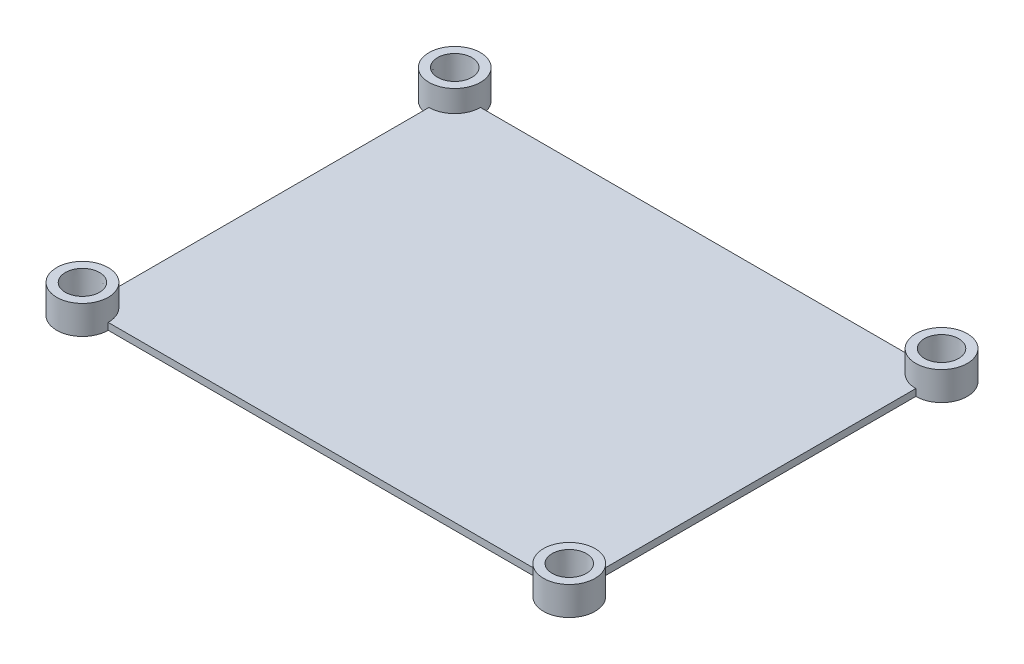
ISO-10303-21;
HEADER;
FILE_DESCRIPTION(('STEP AP214'),'2;1');
FILE_NAME('part.step','',(''),(''),'','','');
FILE_SCHEMA(('AUTOMOTIVE_DESIGN { 1 0 10303 214 1 1 1 1 }'));
ENDSEC;
DATA;
#1=APPLICATION_CONTEXT('core data for automotive mechanical design processes');
#2=APPLICATION_PROTOCOL_DEFINITION('international standard','automotive_design',2000,#1);
#3=PRODUCT_CONTEXT('',#1,'mechanical');
#4=PRODUCT('Part','Part','',(#3));
#5=PRODUCT_RELATED_PRODUCT_CATEGORY('part','',(#4));
#6=PRODUCT_DEFINITION_FORMATION('','',#4);
#7=PRODUCT_DEFINITION_CONTEXT('part definition',#1,'design');
#8=PRODUCT_DEFINITION('design','',#6,#7);
#9=PRODUCT_DEFINITION_SHAPE('','',#8);
#10=(LENGTH_UNIT() NAMED_UNIT(*) SI_UNIT(.MILLI.,.METRE.));
#11=(NAMED_UNIT(*) PLANE_ANGLE_UNIT() SI_UNIT($,.RADIAN.));
#12=(NAMED_UNIT(*) SI_UNIT($,.STERADIAN.) SOLID_ANGLE_UNIT());
#13=UNCERTAINTY_MEASURE_WITH_UNIT(LENGTH_MEASURE(1.E-05),#10,'distance_accuracy_value','');
#14=(GEOMETRIC_REPRESENTATION_CONTEXT(3) GLOBAL_UNCERTAINTY_ASSIGNED_CONTEXT((#13)) GLOBAL_UNIT_ASSIGNED_CONTEXT((#10,
#11,#12)) REPRESENTATION_CONTEXT('',''));
#15=CARTESIAN_POINT('',(0.,0.,0.));
#16=DIRECTION('',(0.,0.,1.));
#17=DIRECTION('',(1.,0.,0.));
#18=AXIS2_PLACEMENT_3D('',#15,#16,#17);
#19=CARTESIAN_POINT('',(0.,1.2,0.));
#20=DIRECTION('',(0.,1.,0.));
#21=DIRECTION('',(0.,0.,1.));
#22=AXIS2_PLACEMENT_3D('',#19,#20,#21);
#23=PLANE('',#22);
#24=DIRECTION('',(-1.,0.,0.));
#25=VECTOR('',#24,1.);
#26=CARTESIAN_POINT('',(0.,1.2,-65.));
#27=LINE('',#26,#25);
#28=CARTESIAN_POINT('',(80.5,1.2,-65.));
#29=VERTEX_POINT('',#28);
#30=CARTESIAN_POINT('',(4.5,1.2,-65.));
#31=VERTEX_POINT('',#30);
#32=EDGE_CURVE('E161',#29,#31,#27,.T.);
#33=ORIENTED_EDGE('',*,*,#32,.T.);
#34=CARTESIAN_POINT('',(0.,1.2,-65.));
#35=DIRECTION('',(0.,1.,0.));
#36=DIRECTION('',(0.,0.,1.));
#37=AXIS2_PLACEMENT_3D('',#34,#35,#36);
#38=CIRCLE('',#37,4.5);
#39=CARTESIAN_POINT('',(0.,1.2,-60.5));
#40=VERTEX_POINT('',#39);
#41=EDGE_CURVE('E124',#31,#40,#38,.F.);
#42=ORIENTED_EDGE('',*,*,#41,.T.);
#43=DIRECTION('',(0.,0.,1.));
#44=VECTOR('',#43,1.);
#45=CARTESIAN_POINT('',(0.,1.2,-65.));
#46=LINE('',#45,#44);
#47=CARTESIAN_POINT('',(0.,1.2,-4.5));
#48=VERTEX_POINT('',#47);
#49=EDGE_CURVE('E116',#40,#48,#46,.T.);
#50=ORIENTED_EDGE('',*,*,#49,.T.);
#51=CARTESIAN_POINT('',(0.,1.2,0.));
#52=DIRECTION('',(0.,1.,0.));
#53=DIRECTION('',(0.,0.,1.));
#54=AXIS2_PLACEMENT_3D('',#51,#52,#53);
#55=CIRCLE('',#54,4.5);
#56=CARTESIAN_POINT('',(4.5,1.2,0.));
#57=VERTEX_POINT('',#56);
#58=EDGE_CURVE('E176',#57,#48,#55,.T.);
#59=ORIENTED_EDGE('',*,*,#58,.F.);
#60=DIRECTION('',(1.,0.,0.));
#61=VECTOR('',#60,1.);
#62=CARTESIAN_POINT('',(0.,1.2,0.));
#63=LINE('',#62,#61);
#64=CARTESIAN_POINT('',(80.5,1.2,0.));
#65=VERTEX_POINT('',#64);
#66=EDGE_CURVE('E154',#57,#65,#63,.T.);
#67=ORIENTED_EDGE('',*,*,#66,.T.);
#68=CARTESIAN_POINT('',(85.,1.2,0.));
#69=DIRECTION('',(0.,1.,0.));
#70=DIRECTION('',(0.,0.,1.));
#71=AXIS2_PLACEMENT_3D('',#68,#69,#70);
#72=CIRCLE('',#71,4.5);
#73=CARTESIAN_POINT('',(85.,1.2,-4.5));
#74=VERTEX_POINT('',#73);
#75=EDGE_CURVE('E147',#65,#74,#72,.F.);
#76=ORIENTED_EDGE('',*,*,#75,.T.);
#77=DIRECTION('',(0.,0.,-1.));
#78=VECTOR('',#77,1.);
#79=CARTESIAN_POINT('',(85.,1.2,-65.));
#80=LINE('',#79,#78);
#81=CARTESIAN_POINT('',(85.,1.2,-60.5));
#82=VERTEX_POINT('',#81);
#83=EDGE_CURVE('E158',#74,#82,#80,.T.);
#84=ORIENTED_EDGE('',*,*,#83,.T.);
#85=CARTESIAN_POINT('',(85.,1.2,-65.));
#86=DIRECTION('',(0.,1.,0.));
#87=DIRECTION('',(0.,0.,1.));
#88=AXIS2_PLACEMENT_3D('',#85,#86,#87);
#89=CIRCLE('',#88,4.50000000000001);
#90=EDGE_CURVE('E136',#82,#29,#89,.F.);
#91=ORIENTED_EDGE('',*,*,#90,.T.);
#92=EDGE_LOOP('',(#33,#42,#50,#59,#67,#76,#84,#91));
#93=FACE_BOUND('',#92,.T.);
#94=ADVANCED_FACE('F37',(#93),#23,.T.);
#95=CARTESIAN_POINT('',(0.,1.2,-65.));
#96=DIRECTION('',(0.,0.,1.));
#97=DIRECTION('',(1.,0.,0.));
#98=AXIS2_PLACEMENT_3D('',#95,#96,#97);
#99=PLANE('',#98);
#100=DIRECTION('',(0.,-1.,0.));
#101=VECTOR('',#100,1.);
#102=CARTESIAN_POINT('',(4.5,5.,-65.));
#103=LINE('',#102,#101);
#104=CARTESIAN_POINT('',(4.5,0.,-65.));
#105=VERTEX_POINT('',#104);
#106=EDGE_CURVE('E52',#31,#105,#103,.T.);
#107=ORIENTED_EDGE('',*,*,#106,.F.);
#108=ORIENTED_EDGE('',*,*,#32,.F.);
#109=DIRECTION('',(0.,-1.,0.));
#110=VECTOR('',#109,1.);
#111=CARTESIAN_POINT('',(80.5,5.,-65.));
#112=LINE('',#111,#110);
#113=CARTESIAN_POINT('',(80.5,0.,-65.));
#114=VERTEX_POINT('',#113);
#115=EDGE_CURVE('E45',#114,#29,#112,.F.);
#116=ORIENTED_EDGE('',*,*,#115,.F.);
#117=DIRECTION('',(-1.,0.,0.));
#118=VECTOR('',#117,1.);
#119=CARTESIAN_POINT('',(0.,0.,-65.));
#120=LINE('',#119,#118);
#121=EDGE_CURVE('E57',#114,#105,#120,.T.);
#122=ORIENTED_EDGE('',*,*,#121,.T.);
#123=EDGE_LOOP('',(#107,#108,#116,#122));
#124=FACE_BOUND('',#123,.T.);
#125=ADVANCED_FACE('F187',(#124),#99,.F.);
#126=CARTESIAN_POINT('',(0.,1.2,-65.));
#127=DIRECTION('',(1.,0.,0.));
#128=DIRECTION('',(0.,0.,-1.));
#129=AXIS2_PLACEMENT_3D('',#126,#127,#128);
#130=PLANE('',#129);
#131=DIRECTION('',(0.,-1.,0.));
#132=VECTOR('',#131,1.);
#133=CARTESIAN_POINT('',(0.,5.,-60.5));
#134=LINE('',#133,#132);
#135=CARTESIAN_POINT('',(0.,0.,-60.5));
#136=VERTEX_POINT('',#135);
#137=EDGE_CURVE('E11',#136,#40,#134,.F.);
#138=ORIENTED_EDGE('',*,*,#137,.F.);
#139=DIRECTION('',(0.,0.,1.));
#140=VECTOR('',#139,1.);
#141=CARTESIAN_POINT('',(0.,0.,-65.));
#142=LINE('',#141,#140);
#143=CARTESIAN_POINT('',(0.,0.,-4.5));
#144=VERTEX_POINT('',#143);
#145=EDGE_CURVE('E101',#136,#144,#142,.T.);
#146=ORIENTED_EDGE('',*,*,#145,.T.);
#147=DIRECTION('',(0.,-1.,0.));
#148=VECTOR('',#147,1.);
#149=CARTESIAN_POINT('',(0.,5.,-4.5));
#150=LINE('',#149,#148);
#151=EDGE_CURVE('E171',#144,#48,#150,.F.);
#152=ORIENTED_EDGE('',*,*,#151,.T.);
#153=ORIENTED_EDGE('',*,*,#49,.F.);
#154=EDGE_LOOP('',(#138,#146,#152,#153));
#155=FACE_BOUND('',#154,.T.);
#156=ADVANCED_FACE('F115',(#155),#130,.F.);
#157=CARTESIAN_POINT('',(85.,1.2,-65.));
#158=DIRECTION('',(-1.,0.,0.));
#159=DIRECTION('',(0.,0.,1.));
#160=AXIS2_PLACEMENT_3D('',#157,#158,#159);
#161=PLANE('',#160);
#162=DIRECTION('',(0.,-1.,0.));
#163=VECTOR('',#162,1.);
#164=CARTESIAN_POINT('',(85.,5.,-60.5));
#165=LINE('',#164,#163);
#166=CARTESIAN_POINT('',(85.,0.,-60.5));
#167=VERTEX_POINT('',#166);
#168=EDGE_CURVE('E140',#82,#167,#165,.T.);
#169=ORIENTED_EDGE('',*,*,#168,.F.);
#170=ORIENTED_EDGE('',*,*,#83,.F.);
#171=DIRECTION('',(0.,-1.,0.));
#172=VECTOR('',#171,1.);
#173=CARTESIAN_POINT('',(85.,5.,-4.5));
#174=LINE('',#173,#172);
#175=CARTESIAN_POINT('',(85.,0.,-4.5));
#176=VERTEX_POINT('',#175);
#177=EDGE_CURVE('E180',#176,#74,#174,.F.);
#178=ORIENTED_EDGE('',*,*,#177,.F.);
#179=DIRECTION('',(0.,0.,-1.));
#180=VECTOR('',#179,1.);
#181=CARTESIAN_POINT('',(85.,0.,-65.));
#182=LINE('',#181,#180);
#183=EDGE_CURVE('E166',#176,#167,#182,.T.);
#184=ORIENTED_EDGE('',*,*,#183,.T.);
#185=EDGE_LOOP('',(#169,#170,#178,#184));
#186=FACE_BOUND('',#185,.T.);
#187=ADVANCED_FACE('F193',(#186),#161,.F.);
#188=CARTESIAN_POINT('',(0.,1.2,0.));
#189=DIRECTION('',(0.,0.,-1.));
#190=DIRECTION('',(-1.,0.,0.));
#191=AXIS2_PLACEMENT_3D('',#188,#189,#190);
#192=PLANE('',#191);
#193=DIRECTION('',(0.,-1.,0.));
#194=VECTOR('',#193,1.);
#195=CARTESIAN_POINT('',(80.5,5.,0.));
#196=LINE('',#195,#194);
#197=CARTESIAN_POINT('',(80.5,0.,0.));
#198=VERTEX_POINT('',#197);
#199=EDGE_CURVE('E112',#65,#198,#196,.T.);
#200=ORIENTED_EDGE('',*,*,#199,.F.);
#201=ORIENTED_EDGE('',*,*,#66,.F.);
#202=DIRECTION('',(0.,-1.,0.));
#203=VECTOR('',#202,1.);
#204=CARTESIAN_POINT('',(4.5,5.,0.));
#205=LINE('',#204,#203);
#206=CARTESIAN_POINT('',(4.5,0.,0.));
#207=VERTEX_POINT('',#206);
#208=EDGE_CURVE('E162',#57,#207,#205,.T.);
#209=ORIENTED_EDGE('',*,*,#208,.T.);
#210=DIRECTION('',(1.,0.,0.));
#211=VECTOR('',#210,1.);
#212=CARTESIAN_POINT('',(0.,0.,0.));
#213=LINE('',#212,#211);
#214=EDGE_CURVE('E111',#207,#198,#213,.T.);
#215=ORIENTED_EDGE('',*,*,#214,.T.);
#216=EDGE_LOOP('',(#200,#201,#209,#215));
#217=FACE_BOUND('',#216,.T.);
#218=ADVANCED_FACE('F198',(#217),#192,.F.);
#219=CARTESIAN_POINT('',(0.,5.,0.));
#220=DIRECTION('',(0.,-1.,0.));
#221=DIRECTION('',(0.,0.,-1.));
#222=AXIS2_PLACEMENT_3D('',#219,#220,#221);
#223=CYLINDRICAL_SURFACE('',#222,4.5);
#224=CARTESIAN_POINT('',(0.,5.,0.));
#225=DIRECTION('',(0.,1.,0.));
#226=DIRECTION('',(0.,0.,1.));
#227=AXIS2_PLACEMENT_3D('',#224,#225,#226);
#228=CIRCLE('',#227,4.5);
#229=CARTESIAN_POINT('',(0.,5.,4.5));
#230=VERTEX_POINT('',#229);
#231=EDGE_CURVE('E173',#230,#230,#228,.T.);
#232=ORIENTED_EDGE('',*,*,#231,.F.);
#233=EDGE_LOOP('',(#232));
#234=FACE_BOUND('',#233,.T.);
#235=ORIENTED_EDGE('',*,*,#151,.F.);
#236=CARTESIAN_POINT('',(0.,0.,0.));
#237=DIRECTION('',(0.,1.,0.));
#238=DIRECTION('',(0.,0.,1.));
#239=AXIS2_PLACEMENT_3D('',#236,#237,#238);
#240=CIRCLE('',#239,4.5);
#241=EDGE_CURVE('E107',#144,#207,#240,.T.);
#242=ORIENTED_EDGE('',*,*,#241,.T.);
#243=ORIENTED_EDGE('',*,*,#208,.F.);
#244=ORIENTED_EDGE('',*,*,#58,.T.);
#245=EDGE_LOOP('',(#235,#242,#243,#244));
#246=FACE_BOUND('',#245,.T.);
#247=ADVANCED_FACE('F39',(#234,#246),#223,.T.);
#248=CARTESIAN_POINT('',(0.,5.,0.));
#249=DIRECTION('',(0.,1.,0.));
#250=DIRECTION('',(0.,0.,1.));
#251=AXIS2_PLACEMENT_3D('',#248,#249,#250);
#252=PLANE('',#251);
#253=CARTESIAN_POINT('',(0.,5.,0.));
#254=DIRECTION('',(0.,1.,0.));
#255=DIRECTION('',(0.,0.,1.));
#256=AXIS2_PLACEMENT_3D('',#253,#254,#255);
#257=CIRCLE('',#256,2.995);
#258=CARTESIAN_POINT('',(0.,5.,2.995));
#259=VERTEX_POINT('',#258);
#260=EDGE_CURVE('E292',#259,#259,#257,.T.);
#261=ORIENTED_EDGE('',*,*,#260,.F.);
#262=EDGE_LOOP('',(#261));
#263=FACE_BOUND('',#262,.T.);
#264=ORIENTED_EDGE('',*,*,#231,.T.);
#265=EDGE_LOOP('',(#264));
#266=FACE_BOUND('',#265,.T.);
#267=ADVANCED_FACE('F203',(#263,#266),#252,.T.);
#268=CARTESIAN_POINT('',(0.,0.,0.));
#269=DIRECTION('',(0.,1.,0.));
#270=DIRECTION('',(0.,0.,1.));
#271=AXIS2_PLACEMENT_3D('',#268,#269,#270);
#272=PLANE('',#271);
#273=CARTESIAN_POINT('',(0.,0.,-65.));
#274=DIRECTION('',(0.,1.,0.));
#275=DIRECTION('',(0.,0.,1.));
#276=AXIS2_PLACEMENT_3D('',#273,#274,#275);
#277=CIRCLE('',#276,4.5);
#278=EDGE_CURVE('E105',#105,#136,#277,.T.);
#279=ORIENTED_EDGE('',*,*,#278,.F.);
#280=ORIENTED_EDGE('',*,*,#121,.F.);
#281=CARTESIAN_POINT('',(85.,0.,-65.));
#282=DIRECTION('',(0.,1.,0.));
#283=DIRECTION('',(0.,0.,1.));
#284=AXIS2_PLACEMENT_3D('',#281,#282,#283);
#285=CIRCLE('',#284,4.50000000000001);
#286=EDGE_CURVE('E132',#167,#114,#285,.T.);
#287=ORIENTED_EDGE('',*,*,#286,.F.);
#288=ORIENTED_EDGE('',*,*,#183,.F.);
#289=CARTESIAN_POINT('',(85.,0.,0.));
#290=DIRECTION('',(0.,1.,0.));
#291=DIRECTION('',(0.,0.,1.));
#292=AXIS2_PLACEMENT_3D('',#289,#290,#291);
#293=CIRCLE('',#292,4.5);
#294=EDGE_CURVE('E143',#198,#176,#293,.T.);
#295=ORIENTED_EDGE('',*,*,#294,.F.);
#296=ORIENTED_EDGE('',*,*,#214,.F.);
#297=ORIENTED_EDGE('',*,*,#241,.F.);
#298=ORIENTED_EDGE('',*,*,#145,.F.);
#299=EDGE_LOOP('',(#279,#280,#287,#288,#295,#296,#297,#298));
#300=FACE_BOUND('',#299,.T.);
#301=ADVANCED_FACE('F103',(#300),#272,.F.);
#302=CARTESIAN_POINT('',(85.,5.,0.));
#303=DIRECTION('',(0.,-1.,0.));
#304=DIRECTION('',(0.,0.,-1.));
#305=AXIS2_PLACEMENT_3D('',#302,#303,#304);
#306=CYLINDRICAL_SURFACE('',#305,4.5);
#307=CARTESIAN_POINT('',(85.,5.,0.));
#308=DIRECTION('',(0.,1.,0.));
#309=DIRECTION('',(0.,0.,1.));
#310=AXIS2_PLACEMENT_3D('',#307,#308,#309);
#311=CIRCLE('',#310,4.5);
#312=CARTESIAN_POINT('',(85.,5.,4.5));
#313=VERTEX_POINT('',#312);
#314=EDGE_CURVE('E144',#313,#313,#311,.T.);
#315=ORIENTED_EDGE('',*,*,#314,.F.);
#316=EDGE_LOOP('',(#315));
#317=FACE_BOUND('',#316,.T.);
#318=ORIENTED_EDGE('',*,*,#75,.F.);
#319=ORIENTED_EDGE('',*,*,#199,.T.);
#320=ORIENTED_EDGE('',*,*,#294,.T.);
#321=ORIENTED_EDGE('',*,*,#177,.T.);
#322=EDGE_LOOP('',(#318,#319,#320,#321));
#323=FACE_BOUND('',#322,.T.);
#324=ADVANCED_FACE('F195',(#317,#323),#306,.T.);
#325=CARTESIAN_POINT('',(85.,5.,0.));
#326=DIRECTION('',(0.,1.,0.));
#327=DIRECTION('',(0.,0.,1.));
#328=AXIS2_PLACEMENT_3D('',#325,#326,#327);
#329=PLANE('',#328);
#330=CARTESIAN_POINT('',(85.,5.,0.));
#331=DIRECTION('',(0.,1.,0.));
#332=DIRECTION('',(0.,0.,1.));
#333=AXIS2_PLACEMENT_3D('',#330,#331,#332);
#334=CIRCLE('',#333,2.995);
#335=CARTESIAN_POINT('',(85.,5.,2.995));
#336=VERTEX_POINT('',#335);
#337=EDGE_CURVE('E291',#336,#336,#334,.T.);
#338=ORIENTED_EDGE('',*,*,#337,.F.);
#339=EDGE_LOOP('',(#338));
#340=FACE_BOUND('',#339,.T.);
#341=ORIENTED_EDGE('',*,*,#314,.T.);
#342=EDGE_LOOP('',(#341));
#343=FACE_BOUND('',#342,.T.);
#344=ADVANCED_FACE('F229',(#340,#343),#329,.T.);
#345=CARTESIAN_POINT('',(85.,5.,-65.));
#346=DIRECTION('',(0.,-1.,0.));
#347=DIRECTION('',(0.,0.,-1.));
#348=AXIS2_PLACEMENT_3D('',#345,#346,#347);
#349=CYLINDRICAL_SURFACE('',#348,4.50000000000001);
#350=CARTESIAN_POINT('',(85.,5.,-65.));
#351=DIRECTION('',(0.,1.,0.));
#352=DIRECTION('',(0.,0.,1.));
#353=AXIS2_PLACEMENT_3D('',#350,#351,#352);
#354=CIRCLE('',#353,4.50000000000001);
#355=CARTESIAN_POINT('',(85.,5.,-60.5));
#356=VERTEX_POINT('',#355);
#357=EDGE_CURVE('E133',#356,#356,#354,.T.);
#358=ORIENTED_EDGE('',*,*,#357,.F.);
#359=EDGE_LOOP('',(#358));
#360=FACE_BOUND('',#359,.T.);
#361=ORIENTED_EDGE('',*,*,#90,.F.);
#362=ORIENTED_EDGE('',*,*,#168,.T.);
#363=ORIENTED_EDGE('',*,*,#286,.T.);
#364=ORIENTED_EDGE('',*,*,#115,.T.);
#365=EDGE_LOOP('',(#361,#362,#363,#364));
#366=FACE_BOUND('',#365,.T.);
#367=ADVANCED_FACE('F185',(#360,#366),#349,.T.);
#368=CARTESIAN_POINT('',(85.,5.,-65.));
#369=DIRECTION('',(0.,1.,0.));
#370=DIRECTION('',(0.,0.,1.));
#371=AXIS2_PLACEMENT_3D('',#368,#369,#370);
#372=PLANE('',#371);
#373=CARTESIAN_POINT('',(85.,5.,-65.));
#374=DIRECTION('',(0.,1.,0.));
#375=DIRECTION('',(0.,0.,1.));
#376=AXIS2_PLACEMENT_3D('',#373,#374,#375);
#377=CIRCLE('',#376,2.995);
#378=CARTESIAN_POINT('',(85.,5.,-62.005));
#379=VERTEX_POINT('',#378);
#380=EDGE_CURVE('E302',#379,#379,#377,.T.);
#381=ORIENTED_EDGE('',*,*,#380,.F.);
#382=EDGE_LOOP('',(#381));
#383=FACE_BOUND('',#382,.T.);
#384=ORIENTED_EDGE('',*,*,#357,.T.);
#385=EDGE_LOOP('',(#384));
#386=FACE_BOUND('',#385,.T.);
#387=ADVANCED_FACE('F240',(#383,#386),#372,.T.);
#388=CARTESIAN_POINT('',(0.,5.,-65.));
#389=DIRECTION('',(0.,-1.,0.));
#390=DIRECTION('',(0.,0.,-1.));
#391=AXIS2_PLACEMENT_3D('',#388,#389,#390);
#392=CYLINDRICAL_SURFACE('',#391,4.5);
#393=CARTESIAN_POINT('',(0.,5.,-65.));
#394=DIRECTION('',(0.,1.,0.));
#395=DIRECTION('',(0.,0.,1.));
#396=AXIS2_PLACEMENT_3D('',#393,#394,#395);
#397=CIRCLE('',#396,4.5);
#398=CARTESIAN_POINT('',(0.,5.,-60.5));
#399=VERTEX_POINT('',#398);
#400=EDGE_CURVE('E120',#399,#399,#397,.T.);
#401=ORIENTED_EDGE('',*,*,#400,.F.);
#402=EDGE_LOOP('',(#401));
#403=FACE_BOUND('',#402,.T.);
#404=ORIENTED_EDGE('',*,*,#41,.F.);
#405=ORIENTED_EDGE('',*,*,#106,.T.);
#406=ORIENTED_EDGE('',*,*,#278,.T.);
#407=ORIENTED_EDGE('',*,*,#137,.T.);
#408=EDGE_LOOP('',(#404,#405,#406,#407));
#409=FACE_BOUND('',#408,.T.);
#410=ADVANCED_FACE('F119',(#403,#409),#392,.T.);
#411=CARTESIAN_POINT('',(0.,5.,-65.));
#412=DIRECTION('',(0.,1.,0.));
#413=DIRECTION('',(0.,0.,1.));
#414=AXIS2_PLACEMENT_3D('',#411,#412,#413);
#415=PLANE('',#414);
#416=CARTESIAN_POINT('',(0.,5.,-65.));
#417=DIRECTION('',(0.,1.,0.));
#418=DIRECTION('',(0.,0.,1.));
#419=AXIS2_PLACEMENT_3D('',#416,#417,#418);
#420=CIRCLE('',#419,2.995);
#421=CARTESIAN_POINT('',(0.,5.,-62.005));
#422=VERTEX_POINT('',#421);
#423=EDGE_CURVE('E127',#422,#422,#420,.T.);
#424=ORIENTED_EDGE('',*,*,#423,.F.);
#425=EDGE_LOOP('',(#424));
#426=FACE_BOUND('',#425,.T.);
#427=ORIENTED_EDGE('',*,*,#400,.T.);
#428=EDGE_LOOP('',(#427));
#429=FACE_BOUND('',#428,.T.);
#430=ADVANCED_FACE('F250',(#426,#429),#415,.T.);
#431=CARTESIAN_POINT('',(0.,5.,-65.));
#432=DIRECTION('',(0.,1.,0.));
#433=DIRECTION('',(0.,0.,1.));
#434=AXIS2_PLACEMENT_3D('',#431,#432,#433);
#435=CONICAL_SURFACE('',#434,2.995,0.0349065850398866);
#436=CARTESIAN_POINT('',(0.,0.3,-65.));
#437=DIRECTION('',(0.,1.,0.));
#438=DIRECTION('',(0.,0.,1.));
#439=AXIS2_PLACEMENT_3D('',#436,#437,#438);
#440=CIRCLE('',#439,2.83087238338878);
#441=CARTESIAN_POINT('',(0.,0.3,-62.1691276166112));
#442=VERTEX_POINT('',#441);
#443=EDGE_CURVE('E121',#442,#442,#440,.T.);
#444=ORIENTED_EDGE('',*,*,#443,.F.);
#445=EDGE_LOOP('',(#444));
#446=FACE_BOUND('',#445,.T.);
#447=ORIENTED_EDGE('',*,*,#423,.T.);
#448=EDGE_LOOP('',(#447));
#449=FACE_BOUND('',#448,.T.);
#450=ADVANCED_FACE('F254',(#446,#449),#435,.F.);
#451=CARTESIAN_POINT('',(0.,0.3,-65.));
#452=DIRECTION('',(0.,1.,0.));
#453=DIRECTION('',(0.,0.,1.));
#454=AXIS2_PLACEMENT_3D('',#451,#452,#453);
#455=PLANE('',#454);
#456=ORIENTED_EDGE('',*,*,#443,.T.);
#457=EDGE_LOOP('',(#456));
#458=FACE_BOUND('',#457,.T.);
#459=ADVANCED_FACE('F258',(#458),#455,.T.);
#460=CARTESIAN_POINT('',(85.,5.,-65.));
#461=DIRECTION('',(0.,1.,0.));
#462=DIRECTION('',(0.,0.,1.));
#463=AXIS2_PLACEMENT_3D('',#460,#461,#462);
#464=CONICAL_SURFACE('',#463,2.995,0.0349065850398866);
#465=CARTESIAN_POINT('',(85.,0.3,-65.));
#466=DIRECTION('',(0.,1.,0.));
#467=DIRECTION('',(0.,0.,1.));
#468=AXIS2_PLACEMENT_3D('',#465,#466,#467);
#469=CIRCLE('',#468,2.83087238338879);
#470=CARTESIAN_POINT('',(85.,0.3,-62.1691276166112));
#471=VERTEX_POINT('',#470);
#472=EDGE_CURVE('E305',#471,#471,#469,.T.);
#473=ORIENTED_EDGE('',*,*,#472,.F.);
#474=EDGE_LOOP('',(#473));
#475=FACE_BOUND('',#474,.T.);
#476=ORIENTED_EDGE('',*,*,#380,.T.);
#477=EDGE_LOOP('',(#476));
#478=FACE_BOUND('',#477,.T.);
#479=ADVANCED_FACE('F262',(#475,#478),#464,.F.);
#480=CARTESIAN_POINT('',(85.,0.3,-65.));
#481=DIRECTION('',(0.,1.,0.));
#482=DIRECTION('',(0.,0.,1.));
#483=AXIS2_PLACEMENT_3D('',#480,#481,#482);
#484=PLANE('',#483);
#485=ORIENTED_EDGE('',*,*,#472,.T.);
#486=EDGE_LOOP('',(#485));
#487=FACE_BOUND('',#486,.T.);
#488=ADVANCED_FACE('F266',(#487),#484,.T.);
#489=CARTESIAN_POINT('',(85.,5.,0.));
#490=DIRECTION('',(0.,1.,0.));
#491=DIRECTION('',(0.,0.,1.));
#492=AXIS2_PLACEMENT_3D('',#489,#490,#491);
#493=CONICAL_SURFACE('',#492,2.995,0.0349065850398866);
#494=CARTESIAN_POINT('',(85.,0.3,0.));
#495=DIRECTION('',(0.,1.,0.));
#496=DIRECTION('',(0.,0.,1.));
#497=AXIS2_PLACEMENT_3D('',#494,#495,#496);
#498=CIRCLE('',#497,2.83087238338879);
#499=CARTESIAN_POINT('',(85.,0.3,2.83087238338879));
#500=VERTEX_POINT('',#499);
#501=EDGE_CURVE('E295',#500,#500,#498,.T.);
#502=ORIENTED_EDGE('',*,*,#501,.F.);
#503=EDGE_LOOP('',(#502));
#504=FACE_BOUND('',#503,.T.);
#505=ORIENTED_EDGE('',*,*,#337,.T.);
#506=EDGE_LOOP('',(#505));
#507=FACE_BOUND('',#506,.T.);
#508=ADVANCED_FACE('F270',(#504,#507),#493,.F.);
#509=CARTESIAN_POINT('',(85.,0.3,0.));
#510=DIRECTION('',(0.,1.,0.));
#511=DIRECTION('',(0.,0.,1.));
#512=AXIS2_PLACEMENT_3D('',#509,#510,#511);
#513=PLANE('',#512);
#514=ORIENTED_EDGE('',*,*,#501,.T.);
#515=EDGE_LOOP('',(#514));
#516=FACE_BOUND('',#515,.T.);
#517=ADVANCED_FACE('F274',(#516),#513,.T.);
#518=CARTESIAN_POINT('',(0.,5.,0.));
#519=DIRECTION('',(0.,1.,0.));
#520=DIRECTION('',(0.,0.,1.));
#521=AXIS2_PLACEMENT_3D('',#518,#519,#520);
#522=CONICAL_SURFACE('',#521,2.995,0.0349065850398866);
#523=CARTESIAN_POINT('',(0.,0.3,0.));
#524=DIRECTION('',(0.,1.,0.));
#525=DIRECTION('',(0.,0.,1.));
#526=AXIS2_PLACEMENT_3D('',#523,#524,#525);
#527=CIRCLE('',#526,2.83087238338879);
#528=CARTESIAN_POINT('',(0.,0.3,2.83087238338879));
#529=VERTEX_POINT('',#528);
#530=EDGE_CURVE('E290',#529,#529,#527,.T.);
#531=ORIENTED_EDGE('',*,*,#530,.F.);
#532=EDGE_LOOP('',(#531));
#533=FACE_BOUND('',#532,.T.);
#534=ORIENTED_EDGE('',*,*,#260,.T.);
#535=EDGE_LOOP('',(#534));
#536=FACE_BOUND('',#535,.T.);
#537=ADVANCED_FACE('F278',(#533,#536),#522,.F.);
#538=CARTESIAN_POINT('',(0.,0.3,0.));
#539=DIRECTION('',(0.,1.,0.));
#540=DIRECTION('',(0.,0.,1.));
#541=AXIS2_PLACEMENT_3D('',#538,#539,#540);
#542=PLANE('',#541);
#543=ORIENTED_EDGE('',*,*,#530,.T.);
#544=EDGE_LOOP('',(#543));
#545=FACE_BOUND('',#544,.T.);
#546=ADVANCED_FACE('F282',(#545),#542,.T.);
#547=CLOSED_SHELL('',(#94,#125,#156,#187,#218,#247,#267,#301,#324,#344,#367,#387,#410,#430,#450,
#459,#479,#488,#508,#517,#537,#546));
#548=MANIFOLD_SOLID_BREP('B2',#547);
#549=ADVANCED_BREP_SHAPE_REPRESENTATION('',(#18,#548),#14);
#550=SHAPE_DEFINITION_REPRESENTATION(#9,#549);
ENDSEC;
END-ISO-10303-21;
